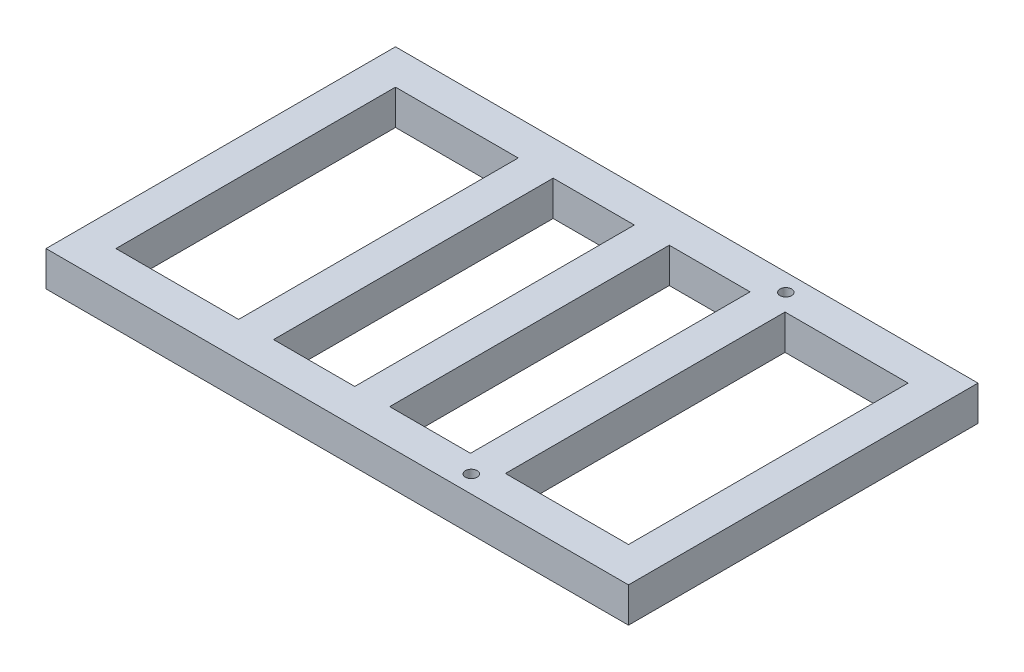
ISO-10303-21;
HEADER;
FILE_DESCRIPTION(('STEP AP214'),'2;1');
FILE_NAME('part.step','',(''),(''),'','','');
FILE_SCHEMA(('AUTOMOTIVE_DESIGN { 1 0 10303 214 1 1 1 1 }'));
ENDSEC;
DATA;
#1=APPLICATION_CONTEXT('core data for automotive mechanical design processes');
#2=APPLICATION_PROTOCOL_DEFINITION('international standard','automotive_design',2000,#1);
#3=PRODUCT_CONTEXT('',#1,'mechanical');
#4=PRODUCT('Part','Part','',(#3));
#5=PRODUCT_RELATED_PRODUCT_CATEGORY('part','',(#4));
#6=PRODUCT_DEFINITION_FORMATION('','',#4);
#7=PRODUCT_DEFINITION_CONTEXT('part definition',#1,'design');
#8=PRODUCT_DEFINITION('design','',#6,#7);
#9=PRODUCT_DEFINITION_SHAPE('','',#8);
#10=(LENGTH_UNIT() NAMED_UNIT(*) SI_UNIT(.MILLI.,.METRE.));
#11=(NAMED_UNIT(*) PLANE_ANGLE_UNIT() SI_UNIT($,.RADIAN.));
#12=(NAMED_UNIT(*) SI_UNIT($,.STERADIAN.) SOLID_ANGLE_UNIT());
#13=UNCERTAINTY_MEASURE_WITH_UNIT(LENGTH_MEASURE(1.E-05),#10,'distance_accuracy_value','');
#14=(GEOMETRIC_REPRESENTATION_CONTEXT(3) GLOBAL_UNCERTAINTY_ASSIGNED_CONTEXT((#13)) GLOBAL_UNIT_ASSIGNED_CONTEXT((#10,
#11,#12)) REPRESENTATION_CONTEXT('',''));
#15=CARTESIAN_POINT('',(0.,0.,0.));
#16=DIRECTION('',(0.,0.,1.));
#17=DIRECTION('',(1.,0.,0.));
#18=AXIS2_PLACEMENT_3D('',#15,#16,#17);
#19=CARTESIAN_POINT('',(-220.,30.,-120.));
#20=DIRECTION('',(0.,0.,1.));
#21=DIRECTION('',(1.,0.,0.));
#22=AXIS2_PLACEMENT_3D('',#19,#20,#21);
#23=PLANE('',#22);
#24=DIRECTION('',(0.,1.,0.));
#25=VECTOR('',#24,1.);
#26=CARTESIAN_POINT('',(114.365311059825,0.,-120.));
#27=LINE('',#26,#25);
#28=CARTESIAN_POINT('',(114.365311059825,0.,-120.));
#29=VERTEX_POINT('',#28);
#30=CARTESIAN_POINT('',(114.365311059825,30.,-120.));
#31=VERTEX_POINT('',#30);
#32=EDGE_CURVE('E195',#29,#31,#27,.T.);
#33=ORIENTED_EDGE('',*,*,#32,.F.);
#34=DIRECTION('',(-1.,0.,0.));
#35=VECTOR('',#34,1.);
#36=CARTESIAN_POINT('',(-220.,0.,-120.));
#37=LINE('',#36,#35);
#38=CARTESIAN_POINT('',(220.,0.,-120.));
#39=VERTEX_POINT('',#38);
#40=EDGE_CURVE('E452',#39,#29,#37,.T.);
#41=ORIENTED_EDGE('',*,*,#40,.F.);
#42=DIRECTION('',(0.,-1.,0.));
#43=VECTOR('',#42,1.);
#44=CARTESIAN_POINT('',(220.,30.,-120.));
#45=LINE('',#44,#43);
#46=CARTESIAN_POINT('',(220.,30.,-120.));
#47=VERTEX_POINT('',#46);
#48=EDGE_CURVE('E259',#47,#39,#45,.T.);
#49=ORIENTED_EDGE('',*,*,#48,.F.);
#50=DIRECTION('',(-1.,0.,0.));
#51=VECTOR('',#50,1.);
#52=CARTESIAN_POINT('',(-220.,30.,-120.));
#53=LINE('',#52,#51);
#54=EDGE_CURVE('E231',#47,#31,#53,.T.);
#55=ORIENTED_EDGE('',*,*,#54,.T.);
#56=EDGE_LOOP('',(#33,#41,#49,#55));
#57=FACE_BOUND('',#56,.T.);
#58=ADVANCED_FACE('F50',(#57),#23,.T.);
#59=CARTESIAN_POINT('',(-220.,30.,120.));
#60=DIRECTION('',(0.,0.,-1.));
#61=DIRECTION('',(-1.,0.,0.));
#62=AXIS2_PLACEMENT_3D('',#59,#60,#61);
#63=PLANE('',#62);
#64=DIRECTION('',(0.,1.,0.));
#65=VECTOR('',#64,1.);
#66=CARTESIAN_POINT('',(114.365311059825,0.,120.));
#67=LINE('',#66,#65);
#68=CARTESIAN_POINT('',(114.365311059825,0.,120.));
#69=VERTEX_POINT('',#68);
#70=CARTESIAN_POINT('',(114.365311059825,30.,120.));
#71=VERTEX_POINT('',#70);
#72=EDGE_CURVE('E192',#69,#71,#67,.T.);
#73=ORIENTED_EDGE('',*,*,#72,.T.);
#74=DIRECTION('',(1.,0.,0.));
#75=VECTOR('',#74,1.);
#76=CARTESIAN_POINT('',(-220.,30.,120.));
#77=LINE('',#76,#75);
#78=CARTESIAN_POINT('',(220.,30.,120.));
#79=VERTEX_POINT('',#78);
#80=EDGE_CURVE('E207',#71,#79,#77,.T.);
#81=ORIENTED_EDGE('',*,*,#80,.T.);
#82=DIRECTION('',(0.,-1.,0.));
#83=VECTOR('',#82,1.);
#84=CARTESIAN_POINT('',(220.,30.,120.));
#85=LINE('',#84,#83);
#86=CARTESIAN_POINT('',(220.,0.,120.));
#87=VERTEX_POINT('',#86);
#88=EDGE_CURVE('E236',#79,#87,#85,.T.);
#89=ORIENTED_EDGE('',*,*,#88,.T.);
#90=DIRECTION('',(1.,0.,0.));
#91=VECTOR('',#90,1.);
#92=CARTESIAN_POINT('',(-220.,0.,120.));
#93=LINE('',#92,#91);
#94=EDGE_CURVE('E209',#69,#87,#93,.T.);
#95=ORIENTED_EDGE('',*,*,#94,.F.);
#96=EDGE_LOOP('',(#73,#81,#89,#95));
#97=FACE_BOUND('',#96,.T.);
#98=ADVANCED_FACE('F205',(#97),#63,.T.);
#99=DIRECTION('',(0.,1.,0.));
#100=VECTOR('',#99,1.);
#101=CARTESIAN_POINT('',(-84.6809785724467,0.,-120.));
#102=LINE('',#101,#100);
#103=CARTESIAN_POINT('',(-84.6809785724467,0.,-120.));
#104=VERTEX_POINT('',#103);
#105=CARTESIAN_POINT('',(-84.6809785724467,30.,-120.));
#106=VERTEX_POINT('',#105);
#107=EDGE_CURVE('E341',#104,#106,#102,.T.);
#108=ORIENTED_EDGE('',*,*,#107,.F.);
#109=CARTESIAN_POINT('',(-15.,0.,-120.));
#110=VERTEX_POINT('',#109);
#111=EDGE_CURVE('E453',#110,#104,#37,.T.);
#112=ORIENTED_EDGE('',*,*,#111,.F.);
#113=DIRECTION('',(0.,1.,0.));
#114=VECTOR('',#113,1.);
#115=CARTESIAN_POINT('',(-15.,0.,-120.));
#116=LINE('',#115,#114);
#117=CARTESIAN_POINT('',(-15.,30.,-120.));
#118=VERTEX_POINT('',#117);
#119=EDGE_CURVE('E386',#110,#118,#116,.T.);
#120=ORIENTED_EDGE('',*,*,#119,.T.);
#121=EDGE_CURVE('E396',#118,#106,#53,.T.);
#122=ORIENTED_EDGE('',*,*,#121,.T.);
#123=EDGE_LOOP('',(#108,#112,#120,#122));
#124=FACE_BOUND('',#123,.T.);
#125=ADVANCED_FACE('F469',(#124),#23,.T.);
#126=DIRECTION('',(0.,1.,0.));
#127=VECTOR('',#126,1.);
#128=CARTESIAN_POINT('',(-84.6809785724467,0.,120.));
#129=LINE('',#128,#127);
#130=CARTESIAN_POINT('',(-84.6809785724467,0.,120.));
#131=VERTEX_POINT('',#130);
#132=CARTESIAN_POINT('',(-84.6809785724467,30.,120.));
#133=VERTEX_POINT('',#132);
#134=EDGE_CURVE('E346',#131,#133,#129,.T.);
#135=ORIENTED_EDGE('',*,*,#134,.T.);
#136=CARTESIAN_POINT('',(-15.,30.,120.));
#137=VERTEX_POINT('',#136);
#138=EDGE_CURVE('E222',#133,#137,#77,.T.);
#139=ORIENTED_EDGE('',*,*,#138,.T.);
#140=DIRECTION('',(0.,1.,0.));
#141=VECTOR('',#140,1.);
#142=CARTESIAN_POINT('',(-15.,0.,120.));
#143=LINE('',#142,#141);
#144=CARTESIAN_POINT('',(-15.,0.,120.));
#145=VERTEX_POINT('',#144);
#146=EDGE_CURVE('E382',#145,#137,#143,.T.);
#147=ORIENTED_EDGE('',*,*,#146,.F.);
#148=EDGE_CURVE('E427',#131,#145,#93,.T.);
#149=ORIENTED_EDGE('',*,*,#148,.F.);
#150=EDGE_LOOP('',(#135,#139,#147,#149));
#151=FACE_BOUND('',#150,.T.);
#152=ADVANCED_FACE('F474',(#151),#63,.T.);
#153=DIRECTION('',(0.,1.,0.));
#154=VECTOR('',#153,1.);
#155=CARTESIAN_POINT('',(84.3653110598249,0.,-120.));
#156=LINE('',#155,#154);
#157=CARTESIAN_POINT('',(84.3653110598248,0.,-120.));
#158=VERTEX_POINT('',#157);
#159=CARTESIAN_POINT('',(84.3653110598249,30.,-120.));
#160=VERTEX_POINT('',#159);
#161=EDGE_CURVE('E320',#158,#160,#156,.T.);
#162=ORIENTED_EDGE('',*,*,#161,.T.);
#163=CARTESIAN_POINT('',(14.9999999999999,30.,-120.));
#164=VERTEX_POINT('',#163);
#165=EDGE_CURVE('E395',#160,#164,#53,.T.);
#166=ORIENTED_EDGE('',*,*,#165,.T.);
#167=DIRECTION('',(0.,1.,0.));
#168=VECTOR('',#167,1.);
#169=CARTESIAN_POINT('',(15.,0.,-120.));
#170=LINE('',#169,#168);
#171=CARTESIAN_POINT('',(14.9999999999999,0.,-120.));
#172=VERTEX_POINT('',#171);
#173=EDGE_CURVE('E370',#172,#164,#170,.T.);
#174=ORIENTED_EDGE('',*,*,#173,.F.);
#175=EDGE_CURVE('E450',#158,#172,#37,.T.);
#176=ORIENTED_EDGE('',*,*,#175,.F.);
#177=EDGE_LOOP('',(#162,#166,#174,#176));
#178=FACE_BOUND('',#177,.T.);
#179=ADVANCED_FACE('F449',(#178),#23,.T.);
#180=DIRECTION('',(0.,1.,0.));
#181=VECTOR('',#180,1.);
#182=CARTESIAN_POINT('',(84.3653110598249,0.,120.));
#183=LINE('',#182,#181);
#184=CARTESIAN_POINT('',(84.3653110598249,0.,120.));
#185=VERTEX_POINT('',#184);
#186=CARTESIAN_POINT('',(84.3653110598249,30.,120.));
#187=VERTEX_POINT('',#186);
#188=EDGE_CURVE('E211',#185,#187,#183,.T.);
#189=ORIENTED_EDGE('',*,*,#188,.F.);
#190=CARTESIAN_POINT('',(14.9999999999999,0.,120.));
#191=VERTEX_POINT('',#190);
#192=EDGE_CURVE('E428',#191,#185,#93,.T.);
#193=ORIENTED_EDGE('',*,*,#192,.F.);
#194=DIRECTION('',(0.,1.,0.));
#195=VECTOR('',#194,1.);
#196=CARTESIAN_POINT('',(15.,0.,120.));
#197=LINE('',#196,#195);
#198=CARTESIAN_POINT('',(15.,30.,120.));
#199=VERTEX_POINT('',#198);
#200=EDGE_CURVE('E377',#191,#199,#197,.T.);
#201=ORIENTED_EDGE('',*,*,#200,.T.);
#202=EDGE_CURVE('E219',#199,#187,#77,.T.);
#203=ORIENTED_EDGE('',*,*,#202,.T.);
#204=EDGE_LOOP('',(#189,#193,#201,#203));
#205=FACE_BOUND('',#204,.T.);
#206=ADVANCED_FACE('F438',(#205),#63,.T.);
#207=CARTESIAN_POINT('',(0.,30.,0.));
#208=DIRECTION('',(0.,1.,0.));
#209=DIRECTION('',(0.,0.,1.));
#210=AXIS2_PLACEMENT_3D('',#207,#208,#209);
#211=PLANE('',#210);
#212=CARTESIAN_POINT('',(100.060395288768,30.,135.));
#213=DIRECTION('',(0.,1.,0.));
#214=DIRECTION('',(0.,0.,1.));
#215=AXIS2_PLACEMENT_3D('',#212,#213,#214);
#216=CIRCLE('',#215,5.00000000000001);
#217=CARTESIAN_POINT('',(100.060395288768,30.,140.));
#218=VERTEX_POINT('',#217);
#219=EDGE_CURVE('E315',#218,#218,#216,.T.);
#220=ORIENTED_EDGE('',*,*,#219,.F.);
#221=EDGE_LOOP('',(#220));
#222=FACE_BOUND('',#221,.T.);
#223=CARTESIAN_POINT('',(100.018449150794,30.,-135.));
#224=DIRECTION('',(0.,1.,0.));
#225=DIRECTION('',(0.,0.,1.));
#226=AXIS2_PLACEMENT_3D('',#223,#224,#225);
#227=CIRCLE('',#226,5.00000000000001);
#228=CARTESIAN_POINT('',(100.018449150794,30.,-130.));
#229=VERTEX_POINT('',#228);
#230=EDGE_CURVE('E300',#229,#229,#227,.T.);
#231=ORIENTED_EDGE('',*,*,#230,.F.);
#232=EDGE_LOOP('',(#231));
#233=FACE_BOUND('',#232,.T.);
#234=ORIENTED_EDGE('',*,*,#80,.F.);
#235=DIRECTION('',(0.,0.,-1.));
#236=VECTOR('',#235,1.);
#237=CARTESIAN_POINT('',(114.365311059825,30.,120.));
#238=LINE('',#237,#236);
#239=EDGE_CURVE('E189',#71,#31,#238,.T.);
#240=ORIENTED_EDGE('',*,*,#239,.T.);
#241=ORIENTED_EDGE('',*,*,#54,.F.);
#242=DIRECTION('',(0.,0.,-1.));
#243=VECTOR('',#242,1.);
#244=CARTESIAN_POINT('',(220.,30.,-120.));
#245=LINE('',#244,#243);
#246=EDGE_CURVE('E217',#79,#47,#245,.T.);
#247=ORIENTED_EDGE('',*,*,#246,.F.);
#248=EDGE_LOOP('',(#234,#240,#241,#247));
#249=FACE_BOUND('',#248,.T.);
#250=CARTESIAN_POINT('',(-114.680978572447,30.,-120.));
#251=VERTEX_POINT('',#250);
#252=CARTESIAN_POINT('',(-220.,30.,-120.));
#253=VERTEX_POINT('',#252);
#254=EDGE_CURVE('E393',#251,#253,#53,.T.);
#255=ORIENTED_EDGE('',*,*,#254,.F.);
#256=DIRECTION('',(0.,0.,1.));
#257=VECTOR('',#256,1.);
#258=CARTESIAN_POINT('',(-114.680978572447,30.,120.));
#259=LINE('',#258,#257);
#260=CARTESIAN_POINT('',(-114.680978572447,30.,120.));
#261=VERTEX_POINT('',#260);
#262=EDGE_CURVE('E337',#251,#261,#259,.T.);
#263=ORIENTED_EDGE('',*,*,#262,.T.);
#264=CARTESIAN_POINT('',(-220.,30.,120.));
#265=VERTEX_POINT('',#264);
#266=EDGE_CURVE('E223',#265,#261,#77,.T.);
#267=ORIENTED_EDGE('',*,*,#266,.F.);
#268=DIRECTION('',(0.,0.,1.));
#269=VECTOR('',#268,1.);
#270=CARTESIAN_POINT('',(-220.,30.,-120.));
#271=LINE('',#270,#269);
#272=EDGE_CURVE('E220',#253,#265,#271,.T.);
#273=ORIENTED_EDGE('',*,*,#272,.F.);
#274=EDGE_LOOP('',(#255,#263,#267,#273));
#275=FACE_BOUND('',#274,.T.);
#276=ORIENTED_EDGE('',*,*,#121,.F.);
#277=DIRECTION('',(0.,0.,1.));
#278=VECTOR('',#277,1.);
#279=CARTESIAN_POINT('',(-15.,30.,-120.));
#280=LINE('',#279,#278);
#281=EDGE_CURVE('E366',#118,#137,#280,.T.);
#282=ORIENTED_EDGE('',*,*,#281,.T.);
#283=ORIENTED_EDGE('',*,*,#138,.F.);
#284=DIRECTION('',(0.,0.,-1.));
#285=VECTOR('',#284,1.);
#286=CARTESIAN_POINT('',(-84.6809785724467,30.,120.));
#287=LINE('',#286,#285);
#288=EDGE_CURVE('E201',#133,#106,#287,.T.);
#289=ORIENTED_EDGE('',*,*,#288,.T.);
#290=EDGE_LOOP('',(#276,#282,#283,#289));
#291=FACE_BOUND('',#290,.T.);
#292=DIRECTION('',(0.,0.,-1.));
#293=VECTOR('',#292,1.);
#294=CARTESIAN_POINT('',(250.,30.,-150.));
#295=LINE('',#294,#293);
#296=CARTESIAN_POINT('',(250.,30.,150.));
#297=VERTEX_POINT('',#296);
#298=CARTESIAN_POINT('',(250.,30.,-150.));
#299=VERTEX_POINT('',#298);
#300=EDGE_CURVE('E264',#297,#299,#295,.T.);
#301=ORIENTED_EDGE('',*,*,#300,.T.);
#302=DIRECTION('',(-1.,0.,0.));
#303=VECTOR('',#302,1.);
#304=CARTESIAN_POINT('',(-250.,30.,-150.));
#305=LINE('',#304,#303);
#306=CARTESIAN_POINT('',(-250.,30.,-150.));
#307=VERTEX_POINT('',#306);
#308=EDGE_CURVE('E268',#299,#307,#305,.T.);
#309=ORIENTED_EDGE('',*,*,#308,.T.);
#310=DIRECTION('',(0.,0.,1.));
#311=VECTOR('',#310,1.);
#312=CARTESIAN_POINT('',(-250.,30.,-150.));
#313=LINE('',#312,#311);
#314=CARTESIAN_POINT('',(-250.,30.,150.));
#315=VERTEX_POINT('',#314);
#316=EDGE_CURVE('E272',#307,#315,#313,.T.);
#317=ORIENTED_EDGE('',*,*,#316,.T.);
#318=DIRECTION('',(1.,0.,0.));
#319=VECTOR('',#318,1.);
#320=CARTESIAN_POINT('',(-250.,30.,150.));
#321=LINE('',#320,#319);
#322=EDGE_CURVE('E275',#315,#297,#321,.T.);
#323=ORIENTED_EDGE('',*,*,#322,.T.);
#324=EDGE_LOOP('',(#301,#309,#317,#323));
#325=FACE_BOUND('',#324,.T.);
#326=DIRECTION('',(0.,0.,1.));
#327=VECTOR('',#326,1.);
#328=CARTESIAN_POINT('',(84.3653110598249,30.,120.));
#329=LINE('',#328,#327);
#330=EDGE_CURVE('E202',#160,#187,#329,.T.);
#331=ORIENTED_EDGE('',*,*,#330,.T.);
#332=ORIENTED_EDGE('',*,*,#202,.F.);
#333=DIRECTION('',(0.,0.,-1.));
#334=VECTOR('',#333,1.);
#335=CARTESIAN_POINT('',(15.,30.,-120.));
#336=LINE('',#335,#334);
#337=EDGE_CURVE('E350',#199,#164,#336,.T.);
#338=ORIENTED_EDGE('',*,*,#337,.T.);
#339=ORIENTED_EDGE('',*,*,#165,.F.);
#340=EDGE_LOOP('',(#331,#332,#338,#339));
#341=FACE_BOUND('',#340,.T.);
#342=ADVANCED_FACE('F215',(#222,#233,#249,#275,#291,#325,#341),#211,.T.);
#343=CARTESIAN_POINT('',(0.,0.,0.));
#344=DIRECTION('',(0.,1.,0.));
#345=DIRECTION('',(0.,0.,1.));
#346=AXIS2_PLACEMENT_3D('',#343,#344,#345);
#347=PLANE('',#346);
#348=CARTESIAN_POINT('',(100.060395288768,0.,135.));
#349=DIRECTION('',(0.,1.,0.));
#350=DIRECTION('',(0.,0.,1.));
#351=AXIS2_PLACEMENT_3D('',#348,#349,#350);
#352=CIRCLE('',#351,5.00000000000001);
#353=CARTESIAN_POINT('',(100.060395288768,0.,140.));
#354=VERTEX_POINT('',#353);
#355=EDGE_CURVE('E54',#354,#354,#352,.T.);
#356=ORIENTED_EDGE('',*,*,#355,.T.);
#357=EDGE_LOOP('',(#356));
#358=FACE_BOUND('',#357,.T.);
#359=CARTESIAN_POINT('',(100.018449150794,0.,-135.));
#360=DIRECTION('',(0.,1.,0.));
#361=DIRECTION('',(0.,0.,1.));
#362=AXIS2_PLACEMENT_3D('',#359,#360,#361);
#363=CIRCLE('',#362,5.00000000000001);
#364=CARTESIAN_POINT('',(100.018449150794,0.,-130.));
#365=VERTEX_POINT('',#364);
#366=EDGE_CURVE('E212',#365,#365,#363,.T.);
#367=ORIENTED_EDGE('',*,*,#366,.T.);
#368=EDGE_LOOP('',(#367));
#369=FACE_BOUND('',#368,.T.);
#370=DIRECTION('',(0.,0.,-1.));
#371=VECTOR('',#370,1.);
#372=CARTESIAN_POINT('',(114.365311059825,0.,120.));
#373=LINE('',#372,#371);
#374=EDGE_CURVE('E68',#69,#29,#373,.T.);
#375=ORIENTED_EDGE('',*,*,#374,.F.);
#376=ORIENTED_EDGE('',*,*,#94,.T.);
#377=DIRECTION('',(0.,0.,-1.));
#378=VECTOR('',#377,1.);
#379=CARTESIAN_POINT('',(220.,0.,-120.));
#380=LINE('',#379,#378);
#381=EDGE_CURVE('E381',#87,#39,#380,.T.);
#382=ORIENTED_EDGE('',*,*,#381,.T.);
#383=ORIENTED_EDGE('',*,*,#40,.T.);
#384=EDGE_LOOP('',(#375,#376,#382,#383));
#385=FACE_BOUND('',#384,.T.);
#386=DIRECTION('',(0.,0.,1.));
#387=VECTOR('',#386,1.);
#388=CARTESIAN_POINT('',(-114.680978572447,0.,120.));
#389=LINE('',#388,#387);
#390=CARTESIAN_POINT('',(-114.680978572447,0.,-120.));
#391=VERTEX_POINT('',#390);
#392=CARTESIAN_POINT('',(-114.680978572447,0.,120.));
#393=VERTEX_POINT('',#392);
#394=EDGE_CURVE('E336',#391,#393,#389,.T.);
#395=ORIENTED_EDGE('',*,*,#394,.F.);
#396=CARTESIAN_POINT('',(-220.,0.,-120.));
#397=VERTEX_POINT('',#396);
#398=EDGE_CURVE('E455',#391,#397,#37,.T.);
#399=ORIENTED_EDGE('',*,*,#398,.T.);
#400=DIRECTION('',(0.,0.,1.));
#401=VECTOR('',#400,1.);
#402=CARTESIAN_POINT('',(-220.,0.,-120.));
#403=LINE('',#402,#401);
#404=CARTESIAN_POINT('',(-220.,0.,120.));
#405=VERTEX_POINT('',#404);
#406=EDGE_CURVE('E416',#397,#405,#403,.T.);
#407=ORIENTED_EDGE('',*,*,#406,.T.);
#408=EDGE_CURVE('E253',#405,#393,#93,.T.);
#409=ORIENTED_EDGE('',*,*,#408,.T.);
#410=EDGE_LOOP('',(#395,#399,#407,#409));
#411=FACE_BOUND('',#410,.T.);
#412=DIRECTION('',(0.,0.,1.));
#413=VECTOR('',#412,1.);
#414=CARTESIAN_POINT('',(-15.,0.,-120.));
#415=LINE('',#414,#413);
#416=EDGE_CURVE('E365',#110,#145,#415,.T.);
#417=ORIENTED_EDGE('',*,*,#416,.F.);
#418=ORIENTED_EDGE('',*,*,#111,.T.);
#419=DIRECTION('',(0.,0.,-1.));
#420=VECTOR('',#419,1.);
#421=CARTESIAN_POINT('',(-84.6809785724467,0.,120.));
#422=LINE('',#421,#420);
#423=EDGE_CURVE('E333',#131,#104,#422,.T.);
#424=ORIENTED_EDGE('',*,*,#423,.F.);
#425=ORIENTED_EDGE('',*,*,#148,.T.);
#426=EDGE_LOOP('',(#417,#418,#424,#425));
#427=FACE_BOUND('',#426,.T.);
#428=DIRECTION('',(0.,0.,-1.));
#429=VECTOR('',#428,1.);
#430=CARTESIAN_POINT('',(250.,0.,-150.));
#431=LINE('',#430,#429);
#432=CARTESIAN_POINT('',(250.,0.,150.));
#433=VERTEX_POINT('',#432);
#434=CARTESIAN_POINT('',(250.,0.,-150.));
#435=VERTEX_POINT('',#434);
#436=EDGE_CURVE('E263',#433,#435,#431,.T.);
#437=ORIENTED_EDGE('',*,*,#436,.F.);
#438=DIRECTION('',(1.,0.,0.));
#439=VECTOR('',#438,1.);
#440=CARTESIAN_POINT('',(-250.,0.,150.));
#441=LINE('',#440,#439);
#442=CARTESIAN_POINT('',(-250.,0.,150.));
#443=VERTEX_POINT('',#442);
#444=EDGE_CURVE('E269',#443,#433,#441,.T.);
#445=ORIENTED_EDGE('',*,*,#444,.F.);
#446=DIRECTION('',(0.,0.,1.));
#447=VECTOR('',#446,1.);
#448=CARTESIAN_POINT('',(-250.,0.,-150.));
#449=LINE('',#448,#447);
#450=CARTESIAN_POINT('',(-250.,0.,-150.));
#451=VERTEX_POINT('',#450);
#452=EDGE_CURVE('E285',#451,#443,#449,.T.);
#453=ORIENTED_EDGE('',*,*,#452,.F.);
#454=DIRECTION('',(-1.,0.,0.));
#455=VECTOR('',#454,1.);
#456=CARTESIAN_POINT('',(-250.,0.,-150.));
#457=LINE('',#456,#455);
#458=EDGE_CURVE('E282',#435,#451,#457,.T.);
#459=ORIENTED_EDGE('',*,*,#458,.F.);
#460=EDGE_LOOP('',(#437,#445,#453,#459));
#461=FACE_BOUND('',#460,.T.);
#462=ORIENTED_EDGE('',*,*,#192,.T.);
#463=DIRECTION('',(0.,0.,1.));
#464=VECTOR('',#463,1.);
#465=CARTESIAN_POINT('',(84.3653110598249,0.,120.));
#466=LINE('',#465,#464);
#467=EDGE_CURVE('E76',#158,#185,#466,.T.);
#468=ORIENTED_EDGE('',*,*,#467,.F.);
#469=ORIENTED_EDGE('',*,*,#175,.T.);
#470=DIRECTION('',(0.,0.,-1.));
#471=VECTOR('',#470,1.);
#472=CARTESIAN_POINT('',(15.,0.,-120.));
#473=LINE('',#472,#471);
#474=EDGE_CURVE('E361',#191,#172,#473,.T.);
#475=ORIENTED_EDGE('',*,*,#474,.F.);
#476=EDGE_LOOP('',(#462,#468,#469,#475));
#477=FACE_BOUND('',#476,.T.);
#478=ADVANCED_FACE('F425',(#358,#369,#385,#411,#427,#461,#477),#347,.F.);
#479=CARTESIAN_POINT('',(250.,30.,-150.));
#480=DIRECTION('',(-1.,0.,0.));
#481=DIRECTION('',(0.,0.,1.));
#482=AXIS2_PLACEMENT_3D('',#479,#480,#481);
#483=PLANE('',#482);
#484=ORIENTED_EDGE('',*,*,#436,.T.);
#485=DIRECTION('',(0.,-1.,0.));
#486=VECTOR('',#485,1.);
#487=CARTESIAN_POINT('',(250.,30.,-150.));
#488=LINE('',#487,#486);
#489=EDGE_CURVE('E11',#299,#435,#488,.T.);
#490=ORIENTED_EDGE('',*,*,#489,.F.);
#491=ORIENTED_EDGE('',*,*,#300,.F.);
#492=DIRECTION('',(0.,-1.,0.));
#493=VECTOR('',#492,1.);
#494=CARTESIAN_POINT('',(250.,30.,150.));
#495=LINE('',#494,#493);
#496=EDGE_CURVE('E278',#297,#433,#495,.T.);
#497=ORIENTED_EDGE('',*,*,#496,.T.);
#498=EDGE_LOOP('',(#484,#490,#491,#497));
#499=FACE_BOUND('',#498,.T.);
#500=ADVANCED_FACE('F52',(#499),#483,.F.);
#501=CARTESIAN_POINT('',(-250.,30.,-150.));
#502=DIRECTION('',(0.,0.,1.));
#503=DIRECTION('',(1.,0.,0.));
#504=AXIS2_PLACEMENT_3D('',#501,#502,#503);
#505=PLANE('',#504);
#506=ORIENTED_EDGE('',*,*,#458,.T.);
#507=DIRECTION('',(0.,-1.,0.));
#508=VECTOR('',#507,1.);
#509=CARTESIAN_POINT('',(-250.,30.,-150.));
#510=LINE('',#509,#508);
#511=EDGE_CURVE('E60',#307,#451,#510,.T.);
#512=ORIENTED_EDGE('',*,*,#511,.F.);
#513=ORIENTED_EDGE('',*,*,#308,.F.);
#514=ORIENTED_EDGE('',*,*,#489,.T.);
#515=EDGE_LOOP('',(#506,#512,#513,#514));
#516=FACE_BOUND('',#515,.T.);
#517=ADVANCED_FACE('F529',(#516),#505,.F.);
#518=CARTESIAN_POINT('',(-250.,30.,-150.));
#519=DIRECTION('',(1.,0.,0.));
#520=DIRECTION('',(0.,0.,-1.));
#521=AXIS2_PLACEMENT_3D('',#518,#519,#520);
#522=PLANE('',#521);
#523=ORIENTED_EDGE('',*,*,#452,.T.);
#524=DIRECTION('',(0.,-1.,0.));
#525=VECTOR('',#524,1.);
#526=CARTESIAN_POINT('',(-250.,30.,150.));
#527=LINE('',#526,#525);
#528=EDGE_CURVE('E292',#315,#443,#527,.T.);
#529=ORIENTED_EDGE('',*,*,#528,.F.);
#530=ORIENTED_EDGE('',*,*,#316,.F.);
#531=ORIENTED_EDGE('',*,*,#511,.T.);
#532=EDGE_LOOP('',(#523,#529,#530,#531));
#533=FACE_BOUND('',#532,.T.);
#534=ADVANCED_FACE('F536',(#533),#522,.F.);
#535=CARTESIAN_POINT('',(-250.,30.,150.));
#536=DIRECTION('',(0.,0.,-1.));
#537=DIRECTION('',(-1.,0.,0.));
#538=AXIS2_PLACEMENT_3D('',#535,#536,#537);
#539=PLANE('',#538);
#540=ORIENTED_EDGE('',*,*,#444,.T.);
#541=ORIENTED_EDGE('',*,*,#496,.F.);
#542=ORIENTED_EDGE('',*,*,#322,.F.);
#543=ORIENTED_EDGE('',*,*,#528,.T.);
#544=EDGE_LOOP('',(#540,#541,#542,#543));
#545=FACE_BOUND('',#544,.T.);
#546=ADVANCED_FACE('F483',(#545),#539,.F.);
#547=CARTESIAN_POINT('',(220.,30.,-120.));
#548=DIRECTION('',(-1.,0.,0.));
#549=DIRECTION('',(0.,0.,1.));
#550=AXIS2_PLACEMENT_3D('',#547,#548,#549);
#551=PLANE('',#550);
#552=ORIENTED_EDGE('',*,*,#381,.F.);
#553=ORIENTED_EDGE('',*,*,#88,.F.);
#554=ORIENTED_EDGE('',*,*,#246,.T.);
#555=ORIENTED_EDGE('',*,*,#48,.T.);
#556=EDGE_LOOP('',(#552,#553,#554,#555));
#557=FACE_BOUND('',#556,.T.);
#558=ADVANCED_FACE('F466',(#557),#551,.T.);
#559=DIRECTION('',(0.,1.,0.));
#560=VECTOR('',#559,1.);
#561=CARTESIAN_POINT('',(-114.680978572447,0.,-120.));
#562=LINE('',#561,#560);
#563=EDGE_CURVE('E354',#391,#251,#562,.T.);
#564=ORIENTED_EDGE('',*,*,#563,.T.);
#565=ORIENTED_EDGE('',*,*,#254,.T.);
#566=DIRECTION('',(0.,-1.,0.));
#567=VECTOR('',#566,1.);
#568=CARTESIAN_POINT('',(-220.,30.,-120.));
#569=LINE('',#568,#567);
#570=EDGE_CURVE('E250',#253,#397,#569,.T.);
#571=ORIENTED_EDGE('',*,*,#570,.T.);
#572=ORIENTED_EDGE('',*,*,#398,.F.);
#573=EDGE_LOOP('',(#564,#565,#571,#572));
#574=FACE_BOUND('',#573,.T.);
#575=ADVANCED_FACE('F408',(#574),#23,.T.);
#576=CARTESIAN_POINT('',(-220.,30.,-120.));
#577=DIRECTION('',(1.,0.,0.));
#578=DIRECTION('',(0.,0.,-1.));
#579=AXIS2_PLACEMENT_3D('',#576,#577,#578);
#580=PLANE('',#579);
#581=ORIENTED_EDGE('',*,*,#406,.F.);
#582=ORIENTED_EDGE('',*,*,#570,.F.);
#583=ORIENTED_EDGE('',*,*,#272,.T.);
#584=DIRECTION('',(0.,-1.,0.));
#585=VECTOR('',#584,1.);
#586=CARTESIAN_POINT('',(-220.,30.,120.));
#587=LINE('',#586,#585);
#588=EDGE_CURVE('E244',#265,#405,#587,.T.);
#589=ORIENTED_EDGE('',*,*,#588,.T.);
#590=EDGE_LOOP('',(#581,#582,#583,#589));
#591=FACE_BOUND('',#590,.T.);
#592=ADVANCED_FACE('F414',(#591),#580,.T.);
#593=DIRECTION('',(0.,1.,0.));
#594=VECTOR('',#593,1.);
#595=CARTESIAN_POINT('',(-114.680978572447,0.,120.));
#596=LINE('',#595,#594);
#597=EDGE_CURVE('E351',#393,#261,#596,.T.);
#598=ORIENTED_EDGE('',*,*,#597,.F.);
#599=ORIENTED_EDGE('',*,*,#408,.F.);
#600=ORIENTED_EDGE('',*,*,#588,.F.);
#601=ORIENTED_EDGE('',*,*,#266,.T.);
#602=EDGE_LOOP('',(#598,#599,#600,#601));
#603=FACE_BOUND('',#602,.T.);
#604=ADVANCED_FACE('F423',(#603),#63,.T.);
#605=CARTESIAN_POINT('',(15.,0.,-120.));
#606=DIRECTION('',(1.,0.,0.));
#607=DIRECTION('',(0.,0.,-1.));
#608=AXIS2_PLACEMENT_3D('',#605,#606,#607);
#609=PLANE('',#608);
#610=ORIENTED_EDGE('',*,*,#337,.F.);
#611=ORIENTED_EDGE('',*,*,#200,.F.);
#612=ORIENTED_EDGE('',*,*,#474,.T.);
#613=ORIENTED_EDGE('',*,*,#173,.T.);
#614=EDGE_LOOP('',(#610,#611,#612,#613));
#615=FACE_BOUND('',#614,.T.);
#616=ADVANCED_FACE('F441',(#615),#609,.T.);
#617=CARTESIAN_POINT('',(-15.,0.,-120.));
#618=DIRECTION('',(-1.,0.,0.));
#619=DIRECTION('',(0.,0.,1.));
#620=AXIS2_PLACEMENT_3D('',#617,#618,#619);
#621=PLANE('',#620);
#622=ORIENTED_EDGE('',*,*,#281,.F.);
#623=ORIENTED_EDGE('',*,*,#119,.F.);
#624=ORIENTED_EDGE('',*,*,#416,.T.);
#625=ORIENTED_EDGE('',*,*,#146,.T.);
#626=EDGE_LOOP('',(#622,#623,#624,#625));
#627=FACE_BOUND('',#626,.T.);
#628=ADVANCED_FACE('F496',(#627),#621,.T.);
#629=CARTESIAN_POINT('',(-84.6809785724467,0.,120.));
#630=DIRECTION('',(1.,0.,0.));
#631=DIRECTION('',(0.,0.,-1.));
#632=AXIS2_PLACEMENT_3D('',#629,#630,#631);
#633=PLANE('',#632);
#634=ORIENTED_EDGE('',*,*,#288,.F.);
#635=ORIENTED_EDGE('',*,*,#134,.F.);
#636=ORIENTED_EDGE('',*,*,#423,.T.);
#637=ORIENTED_EDGE('',*,*,#107,.T.);
#638=EDGE_LOOP('',(#634,#635,#636,#637));
#639=FACE_BOUND('',#638,.T.);
#640=ADVANCED_FACE('F499',(#639),#633,.T.);
#641=CARTESIAN_POINT('',(-114.680978572447,0.,120.));
#642=DIRECTION('',(-1.,0.,0.));
#643=DIRECTION('',(0.,0.,1.));
#644=AXIS2_PLACEMENT_3D('',#641,#642,#643);
#645=PLANE('',#644);
#646=ORIENTED_EDGE('',*,*,#262,.F.);
#647=ORIENTED_EDGE('',*,*,#563,.F.);
#648=ORIENTED_EDGE('',*,*,#394,.T.);
#649=ORIENTED_EDGE('',*,*,#597,.T.);
#650=EDGE_LOOP('',(#646,#647,#648,#649));
#651=FACE_BOUND('',#650,.T.);
#652=ADVANCED_FACE('F419',(#651),#645,.T.);
#653=CARTESIAN_POINT('',(114.365311059825,0.,120.));
#654=DIRECTION('',(1.,0.,0.));
#655=DIRECTION('',(0.,0.,-1.));
#656=AXIS2_PLACEMENT_3D('',#653,#654,#655);
#657=PLANE('',#656);
#658=ORIENTED_EDGE('',*,*,#239,.F.);
#659=ORIENTED_EDGE('',*,*,#72,.F.);
#660=ORIENTED_EDGE('',*,*,#374,.T.);
#661=ORIENTED_EDGE('',*,*,#32,.T.);
#662=EDGE_LOOP('',(#658,#659,#660,#661));
#663=FACE_BOUND('',#662,.T.);
#664=ADVANCED_FACE('F191',(#663),#657,.T.);
#665=CARTESIAN_POINT('',(84.3653110598249,0.,120.));
#666=DIRECTION('',(-1.,0.,0.));
#667=DIRECTION('',(0.,0.,1.));
#668=AXIS2_PLACEMENT_3D('',#665,#666,#667);
#669=PLANE('',#668);
#670=ORIENTED_EDGE('',*,*,#330,.F.);
#671=ORIENTED_EDGE('',*,*,#161,.F.);
#672=ORIENTED_EDGE('',*,*,#467,.T.);
#673=ORIENTED_EDGE('',*,*,#188,.T.);
#674=EDGE_LOOP('',(#670,#671,#672,#673));
#675=FACE_BOUND('',#674,.T.);
#676=ADVANCED_FACE('F446',(#675),#669,.T.);
#677=CARTESIAN_POINT('',(100.018449150794,-2.00000000000002,-135.));
#678=DIRECTION('',(0.,1.,0.));
#679=DIRECTION('',(0.,0.,1.));
#680=AXIS2_PLACEMENT_3D('',#677,#678,#679);
#681=CYLINDRICAL_SURFACE('',#680,5.00000000000001);
#682=ORIENTED_EDGE('',*,*,#230,.T.);
#683=EDGE_LOOP('',(#682));
#684=FACE_BOUND('',#683,.T.);
#685=ORIENTED_EDGE('',*,*,#366,.F.);
#686=EDGE_LOOP('',(#685));
#687=FACE_BOUND('',#686,.T.);
#688=ADVANCED_FACE('F508',(#684,#687),#681,.F.);
#689=CARTESIAN_POINT('',(100.060395288768,-4.00000000000002,135.));
#690=DIRECTION('',(0.,1.,0.));
#691=DIRECTION('',(0.,0.,1.));
#692=AXIS2_PLACEMENT_3D('',#689,#690,#691);
#693=CYLINDRICAL_SURFACE('',#692,5.00000000000001);
#694=ORIENTED_EDGE('',*,*,#219,.T.);
#695=EDGE_LOOP('',(#694));
#696=FACE_BOUND('',#695,.T.);
#697=ORIENTED_EDGE('',*,*,#355,.F.);
#698=EDGE_LOOP('',(#697));
#699=FACE_BOUND('',#698,.T.);
#700=ADVANCED_FACE('F513',(#696,#699),#693,.F.);
#701=CLOSED_SHELL('',(#58,#98,#125,#152,#179,#206,#342,#478,#500,#517,#534,#546,#558,#575,#592,
#604,#616,#628,#640,#652,#664,#676,#688,#700));
#702=MANIFOLD_SOLID_BREP('B2',#701);
#703=ADVANCED_BREP_SHAPE_REPRESENTATION('',(#18,#702),#14);
#704=SHAPE_DEFINITION_REPRESENTATION(#9,#703);
ENDSEC;
END-ISO-10303-21;
